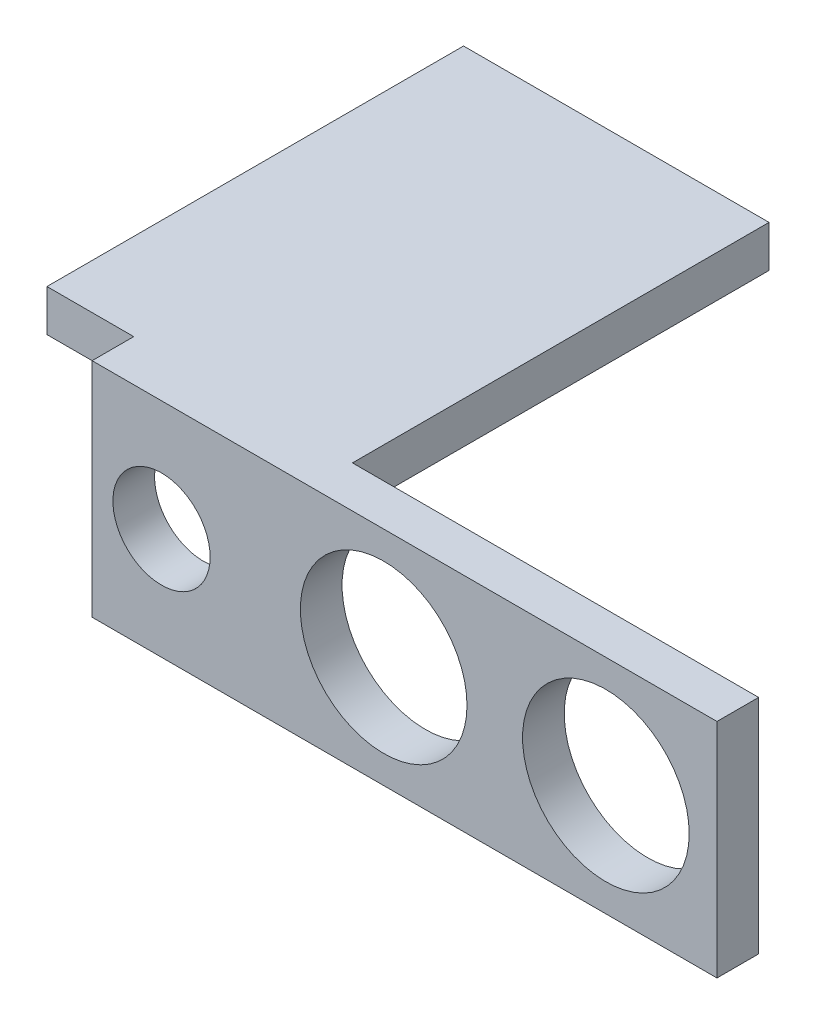
ISO-10303-21;
HEADER;
FILE_DESCRIPTION(('STEP AP214'),'2;1');
FILE_NAME('part.step','',(''),(''),'','','');
FILE_SCHEMA(('AUTOMOTIVE_DESIGN { 1 0 10303 214 1 1 1 1 }'));
ENDSEC;
DATA;
#1=APPLICATION_CONTEXT('core data for automotive mechanical design processes');
#2=APPLICATION_PROTOCOL_DEFINITION('international standard','automotive_design',2000,#1);
#3=PRODUCT_CONTEXT('',#1,'mechanical');
#4=PRODUCT('Part','Part','',(#3));
#5=PRODUCT_RELATED_PRODUCT_CATEGORY('part','',(#4));
#6=PRODUCT_DEFINITION_FORMATION('','',#4);
#7=PRODUCT_DEFINITION_CONTEXT('part definition',#1,'design');
#8=PRODUCT_DEFINITION('design','',#6,#7);
#9=PRODUCT_DEFINITION_SHAPE('','',#8);
#10=(LENGTH_UNIT() NAMED_UNIT(*) SI_UNIT(.MILLI.,.METRE.));
#11=(NAMED_UNIT(*) PLANE_ANGLE_UNIT() SI_UNIT($,.RADIAN.));
#12=(NAMED_UNIT(*) SI_UNIT($,.STERADIAN.) SOLID_ANGLE_UNIT());
#13=UNCERTAINTY_MEASURE_WITH_UNIT(LENGTH_MEASURE(1.E-05),#10,'distance_accuracy_value','');
#14=(GEOMETRIC_REPRESENTATION_CONTEXT(3) GLOBAL_UNCERTAINTY_ASSIGNED_CONTEXT((#13)) GLOBAL_UNIT_ASSIGNED_CONTEXT((#10,
#11,#12)) REPRESENTATION_CONTEXT('',''));
#15=CARTESIAN_POINT('',(0.,0.,0.));
#16=DIRECTION('',(0.,0.,1.));
#17=DIRECTION('',(1.,0.,0.));
#18=AXIS2_PLACEMENT_3D('',#15,#16,#17);
#19=CARTESIAN_POINT('',(0.,0.,0.));
#20=DIRECTION('',(0.,0.,1.));
#21=DIRECTION('',(1.,0.,0.));
#22=AXIS2_PLACEMENT_3D('',#19,#20,#21);
#23=PLANE('',#22);
#24=CARTESIAN_POINT('',(37.,-8.,0.));
#25=DIRECTION('',(0.,0.,1.));
#26=DIRECTION('',(1.,0.,0.));
#27=AXIS2_PLACEMENT_3D('',#24,#25,#26);
#28=CIRCLE('',#27,6.);
#29=CARTESIAN_POINT('',(43.,-8.,0.));
#30=VERTEX_POINT('',#29);
#31=EDGE_CURVE('E130',#30,#30,#28,.T.);
#32=ORIENTED_EDGE('',*,*,#31,.T.);
#33=EDGE_LOOP('',(#32));
#34=FACE_BOUND('',#33,.T.);
#35=CARTESIAN_POINT('',(21.,-8.,0.));
#36=DIRECTION('',(0.,0.,1.));
#37=DIRECTION('',(1.,0.,0.));
#38=AXIS2_PLACEMENT_3D('',#35,#36,#37);
#39=CIRCLE('',#38,6.);
#40=CARTESIAN_POINT('',(27.,-8.,0.));
#41=VERTEX_POINT('',#40);
#42=EDGE_CURVE('E140',#41,#41,#39,.T.);
#43=ORIENTED_EDGE('',*,*,#42,.T.);
#44=EDGE_LOOP('',(#43));
#45=FACE_BOUND('',#44,.T.);
#46=CARTESIAN_POINT('',(5.,-8.,0.));
#47=DIRECTION('',(0.,0.,1.));
#48=DIRECTION('',(1.,0.,0.));
#49=AXIS2_PLACEMENT_3D('',#46,#47,#48);
#50=CIRCLE('',#49,3.5);
#51=CARTESIAN_POINT('',(8.5,-8.,0.));
#52=VERTEX_POINT('',#51);
#53=EDGE_CURVE('E145',#52,#52,#50,.T.);
#54=ORIENTED_EDGE('',*,*,#53,.T.);
#55=EDGE_LOOP('',(#54));
#56=FACE_BOUND('',#55,.T.);
#57=DIRECTION('',(0.,-1.,0.));
#58=VECTOR('',#57,1.);
#59=CARTESIAN_POINT('',(15.75,0.,0.));
#60=LINE('',#59,#58);
#61=CARTESIAN_POINT('',(15.75,0.,0.));
#62=VERTEX_POINT('',#61);
#63=CARTESIAN_POINT('',(15.75,-3.,0.));
#64=VERTEX_POINT('',#63);
#65=EDGE_CURVE('E60',#62,#64,#60,.T.);
#66=ORIENTED_EDGE('',*,*,#65,.F.);
#67=DIRECTION('',(-1.,0.,0.));
#68=VECTOR('',#67,1.);
#69=CARTESIAN_POINT('',(0.,0.,0.));
#70=LINE('',#69,#68);
#71=CARTESIAN_POINT('',(45.,0.,0.));
#72=VERTEX_POINT('',#71);
#73=EDGE_CURVE('E158',#72,#62,#70,.T.);
#74=ORIENTED_EDGE('',*,*,#73,.F.);
#75=DIRECTION('',(0.,1.,0.));
#76=VECTOR('',#75,1.);
#77=CARTESIAN_POINT('',(45.,0.,0.));
#78=LINE('',#77,#76);
#79=CARTESIAN_POINT('',(45.,-16.,0.));
#80=VERTEX_POINT('',#79);
#81=EDGE_CURVE('E169',#80,#72,#78,.T.);
#82=ORIENTED_EDGE('',*,*,#81,.F.);
#83=DIRECTION('',(1.,0.,0.));
#84=VECTOR('',#83,1.);
#85=CARTESIAN_POINT('',(0.,-16.,0.));
#86=LINE('',#85,#84);
#87=CARTESIAN_POINT('',(0.,-16.,0.));
#88=VERTEX_POINT('',#87);
#89=EDGE_CURVE('E167',#88,#80,#86,.T.);
#90=ORIENTED_EDGE('',*,*,#89,.F.);
#91=DIRECTION('',(0.,-1.,0.));
#92=VECTOR('',#91,1.);
#93=CARTESIAN_POINT('',(0.,0.,0.));
#94=LINE('',#93,#92);
#95=CARTESIAN_POINT('',(0.,-3.,0.));
#96=VERTEX_POINT('',#95);
#97=EDGE_CURVE('E151',#96,#88,#94,.T.);
#98=ORIENTED_EDGE('',*,*,#97,.F.);
#99=DIRECTION('',(-1.,0.,0.));
#100=VECTOR('',#99,1.);
#101=CARTESIAN_POINT('',(15.75,-3.,0.));
#102=LINE('',#101,#100);
#103=EDGE_CURVE('E55',#64,#96,#102,.T.);
#104=ORIENTED_EDGE('',*,*,#103,.F.);
#105=EDGE_LOOP('',(#66,#74,#82,#90,#98,#104));
#106=FACE_BOUND('',#105,.T.);
#107=ADVANCED_FACE('F40',(#34,#45,#56,#106),#23,.F.);
#108=CARTESIAN_POINT('',(0.,0.,3.));
#109=DIRECTION('',(0.,0.,1.));
#110=DIRECTION('',(1.,0.,0.));
#111=AXIS2_PLACEMENT_3D('',#108,#109,#110);
#112=PLANE('',#111);
#113=CARTESIAN_POINT('',(21.,-8.,3.));
#114=DIRECTION('',(0.,0.,1.));
#115=DIRECTION('',(1.,0.,0.));
#116=AXIS2_PLACEMENT_3D('',#113,#114,#115);
#117=CIRCLE('',#116,6.);
#118=CARTESIAN_POINT('',(27.,-8.,3.));
#119=VERTEX_POINT('',#118);
#120=EDGE_CURVE('E142',#119,#119,#117,.T.);
#121=ORIENTED_EDGE('',*,*,#120,.F.);
#122=EDGE_LOOP('',(#121));
#123=FACE_BOUND('',#122,.T.);
#124=DIRECTION('',(0.,-1.,0.));
#125=VECTOR('',#124,1.);
#126=CARTESIAN_POINT('',(0.,0.,3.));
#127=LINE('',#126,#125);
#128=CARTESIAN_POINT('',(0.,0.,3.));
#129=VERTEX_POINT('',#128);
#130=CARTESIAN_POINT('',(0.,-16.,3.));
#131=VERTEX_POINT('',#130);
#132=EDGE_CURVE('E154',#129,#131,#127,.T.);
#133=ORIENTED_EDGE('',*,*,#132,.T.);
#134=DIRECTION('',(1.,0.,0.));
#135=VECTOR('',#134,1.);
#136=CARTESIAN_POINT('',(0.,-16.,3.));
#137=LINE('',#136,#135);
#138=CARTESIAN_POINT('',(45.,-16.,3.));
#139=VERTEX_POINT('',#138);
#140=EDGE_CURVE('E157',#131,#139,#137,.T.);
#141=ORIENTED_EDGE('',*,*,#140,.T.);
#142=DIRECTION('',(0.,1.,0.));
#143=VECTOR('',#142,1.);
#144=CARTESIAN_POINT('',(45.,0.,3.));
#145=LINE('',#144,#143);
#146=CARTESIAN_POINT('',(45.,0.,3.));
#147=VERTEX_POINT('',#146);
#148=EDGE_CURVE('E160',#139,#147,#145,.T.);
#149=ORIENTED_EDGE('',*,*,#148,.T.);
#150=DIRECTION('',(-1.,0.,0.));
#151=VECTOR('',#150,1.);
#152=CARTESIAN_POINT('',(0.,0.,3.));
#153=LINE('',#152,#151);
#154=EDGE_CURVE('E162',#147,#129,#153,.T.);
#155=ORIENTED_EDGE('',*,*,#154,.T.);
#156=EDGE_LOOP('',(#133,#141,#149,#155));
#157=FACE_BOUND('',#156,.T.);
#158=CARTESIAN_POINT('',(5.,-8.,3.));
#159=DIRECTION('',(0.,0.,1.));
#160=DIRECTION('',(1.,0.,0.));
#161=AXIS2_PLACEMENT_3D('',#158,#159,#160);
#162=CIRCLE('',#161,3.5);
#163=CARTESIAN_POINT('',(8.5,-8.,3.));
#164=VERTEX_POINT('',#163);
#165=EDGE_CURVE('E148',#164,#164,#162,.T.);
#166=ORIENTED_EDGE('',*,*,#165,.F.);
#167=EDGE_LOOP('',(#166));
#168=FACE_BOUND('',#167,.T.);
#169=CARTESIAN_POINT('',(37.,-8.,3.));
#170=DIRECTION('',(0.,0.,1.));
#171=DIRECTION('',(1.,0.,0.));
#172=AXIS2_PLACEMENT_3D('',#169,#170,#171);
#173=CIRCLE('',#172,6.);
#174=CARTESIAN_POINT('',(43.,-8.,3.));
#175=VERTEX_POINT('',#174);
#176=EDGE_CURVE('E133',#175,#175,#173,.T.);
#177=ORIENTED_EDGE('',*,*,#176,.F.);
#178=EDGE_LOOP('',(#177));
#179=FACE_BOUND('',#178,.T.);
#180=ADVANCED_FACE('F213',(#123,#157,#168,#179),#112,.T.);
#181=CARTESIAN_POINT('',(0.,0.,3.));
#182=DIRECTION('',(1.,0.,0.));
#183=DIRECTION('',(0.,1.,0.));
#184=AXIS2_PLACEMENT_3D('',#181,#182,#183);
#185=PLANE('',#184);
#186=CARTESIAN_POINT('',(0.,0.,0.));
#187=VERTEX_POINT('',#186);
#188=EDGE_CURVE('E165',#187,#96,#94,.T.);
#189=ORIENTED_EDGE('',*,*,#188,.T.);
#190=ORIENTED_EDGE('',*,*,#97,.T.);
#191=DIRECTION('',(0.,0.,-1.));
#192=VECTOR('',#191,1.);
#193=CARTESIAN_POINT('',(0.,-16.,3.));
#194=LINE('',#193,#192);
#195=EDGE_CURVE('E11',#131,#88,#194,.T.);
#196=ORIENTED_EDGE('',*,*,#195,.F.);
#197=ORIENTED_EDGE('',*,*,#132,.F.);
#198=DIRECTION('',(0.,0.,-1.));
#199=VECTOR('',#198,1.);
#200=CARTESIAN_POINT('',(0.,0.,3.));
#201=LINE('',#200,#199);
#202=EDGE_CURVE('E164',#129,#187,#201,.T.);
#203=ORIENTED_EDGE('',*,*,#202,.T.);
#204=EDGE_LOOP('',(#189,#190,#196,#197,#203));
#205=FACE_BOUND('',#204,.T.);
#206=ADVANCED_FACE('F42',(#205),#185,.F.);
#207=CARTESIAN_POINT('',(0.,-16.,3.));
#208=DIRECTION('',(0.,1.,0.));
#209=DIRECTION('',(0.,0.,1.));
#210=AXIS2_PLACEMENT_3D('',#207,#208,#209);
#211=PLANE('',#210);
#212=ORIENTED_EDGE('',*,*,#89,.T.);
#213=DIRECTION('',(0.,0.,-1.));
#214=VECTOR('',#213,1.);
#215=CARTESIAN_POINT('',(45.,-16.,3.));
#216=LINE('',#215,#214);
#217=EDGE_CURVE('E48',#139,#80,#216,.T.);
#218=ORIENTED_EDGE('',*,*,#217,.F.);
#219=ORIENTED_EDGE('',*,*,#140,.F.);
#220=ORIENTED_EDGE('',*,*,#195,.T.);
#221=EDGE_LOOP('',(#212,#218,#219,#220));
#222=FACE_BOUND('',#221,.T.);
#223=ADVANCED_FACE('F215',(#222),#211,.F.);
#224=CARTESIAN_POINT('',(45.,0.,3.));
#225=DIRECTION('',(-1.,0.,0.));
#226=DIRECTION('',(0.,0.,1.));
#227=AXIS2_PLACEMENT_3D('',#224,#225,#226);
#228=PLANE('',#227);
#229=ORIENTED_EDGE('',*,*,#81,.T.);
#230=DIRECTION('',(0.,0.,-1.));
#231=VECTOR('',#230,1.);
#232=CARTESIAN_POINT('',(45.,0.,3.));
#233=LINE('',#232,#231);
#234=EDGE_CURVE('E173',#147,#72,#233,.T.);
#235=ORIENTED_EDGE('',*,*,#234,.F.);
#236=ORIENTED_EDGE('',*,*,#148,.F.);
#237=ORIENTED_EDGE('',*,*,#217,.T.);
#238=EDGE_LOOP('',(#229,#235,#236,#237));
#239=FACE_BOUND('',#238,.T.);
#240=ADVANCED_FACE('F180',(#239),#228,.F.);
#241=CARTESIAN_POINT('',(0.,0.,3.));
#242=DIRECTION('',(0.,-1.,0.));
#243=DIRECTION('',(1.,0.,0.));
#244=AXIS2_PLACEMENT_3D('',#241,#242,#243);
#245=PLANE('',#244);
#246=ORIENTED_EDGE('',*,*,#73,.T.);
#247=DIRECTION('',(0.,0.,1.));
#248=VECTOR('',#247,1.);
#249=CARTESIAN_POINT('',(15.75,0.,-30.));
#250=LINE('',#249,#248);
#251=CARTESIAN_POINT('',(15.75,0.,-30.));
#252=VERTEX_POINT('',#251);
#253=EDGE_CURVE('E186',#252,#62,#250,.T.);
#254=ORIENTED_EDGE('',*,*,#253,.F.);
#255=DIRECTION('',(1.,0.,0.));
#256=VECTOR('',#255,1.);
#257=CARTESIAN_POINT('',(15.75,0.,-30.));
#258=LINE('',#257,#256);
#259=CARTESIAN_POINT('',(-6.25,0.,-30.));
#260=VERTEX_POINT('',#259);
#261=EDGE_CURVE('E123',#260,#252,#258,.T.);
#262=ORIENTED_EDGE('',*,*,#261,.F.);
#263=DIRECTION('',(0.,0.,1.));
#264=VECTOR('',#263,1.);
#265=CARTESIAN_POINT('',(-6.25,0.,-30.));
#266=LINE('',#265,#264);
#267=CARTESIAN_POINT('',(-6.25,0.,0.));
#268=VERTEX_POINT('',#267);
#269=EDGE_CURVE('E135',#260,#268,#266,.T.);
#270=ORIENTED_EDGE('',*,*,#269,.T.);
#271=DIRECTION('',(1.,0.,0.));
#272=VECTOR('',#271,1.);
#273=CARTESIAN_POINT('',(15.75,0.,0.));
#274=LINE('',#273,#272);
#275=EDGE_CURVE('E127',#268,#187,#274,.T.);
#276=ORIENTED_EDGE('',*,*,#275,.T.);
#277=ORIENTED_EDGE('',*,*,#202,.F.);
#278=ORIENTED_EDGE('',*,*,#154,.F.);
#279=ORIENTED_EDGE('',*,*,#234,.T.);
#280=EDGE_LOOP('',(#246,#254,#262,#270,#276,#277,#278,#279));
#281=FACE_BOUND('',#280,.T.);
#282=ADVANCED_FACE('F185',(#281),#245,.F.);
#283=CARTESIAN_POINT('',(5.,-8.,3.));
#284=DIRECTION('',(0.,0.,-1.));
#285=DIRECTION('',(-1.,0.,0.));
#286=AXIS2_PLACEMENT_3D('',#283,#284,#285);
#287=CYLINDRICAL_SURFACE('',#286,3.5);
#288=ORIENTED_EDGE('',*,*,#165,.T.);
#289=EDGE_LOOP('',(#288));
#290=FACE_BOUND('',#289,.T.);
#291=ORIENTED_EDGE('',*,*,#53,.F.);
#292=EDGE_LOOP('',(#291));
#293=FACE_BOUND('',#292,.T.);
#294=ADVANCED_FACE('F234',(#290,#293),#287,.F.);
#295=CARTESIAN_POINT('',(21.,-8.,3.));
#296=DIRECTION('',(0.,0.,-1.));
#297=DIRECTION('',(-1.,0.,0.));
#298=AXIS2_PLACEMENT_3D('',#295,#296,#297);
#299=CYLINDRICAL_SURFACE('',#298,6.);
#300=ORIENTED_EDGE('',*,*,#120,.T.);
#301=EDGE_LOOP('',(#300));
#302=FACE_BOUND('',#301,.T.);
#303=ORIENTED_EDGE('',*,*,#42,.F.);
#304=EDGE_LOOP('',(#303));
#305=FACE_BOUND('',#304,.T.);
#306=ADVANCED_FACE('F238',(#302,#305),#299,.F.);
#307=CARTESIAN_POINT('',(37.,-8.,3.));
#308=DIRECTION('',(0.,0.,-1.));
#309=DIRECTION('',(-1.,0.,0.));
#310=AXIS2_PLACEMENT_3D('',#307,#308,#309);
#311=CYLINDRICAL_SURFACE('',#310,6.);
#312=ORIENTED_EDGE('',*,*,#176,.T.);
#313=EDGE_LOOP('',(#312));
#314=FACE_BOUND('',#313,.T.);
#315=ORIENTED_EDGE('',*,*,#31,.F.);
#316=EDGE_LOOP('',(#315));
#317=FACE_BOUND('',#316,.T.);
#318=ADVANCED_FACE('F243',(#314,#317),#311,.F.);
#319=CARTESIAN_POINT('',(15.75,0.,-30.));
#320=DIRECTION('',(-1.,0.,0.));
#321=DIRECTION('',(0.,0.,1.));
#322=AXIS2_PLACEMENT_3D('',#319,#320,#321);
#323=PLANE('',#322);
#324=ORIENTED_EDGE('',*,*,#65,.T.);
#325=DIRECTION('',(0.,0.,1.));
#326=VECTOR('',#325,1.);
#327=CARTESIAN_POINT('',(15.75,-3.,-30.));
#328=LINE('',#327,#326);
#329=CARTESIAN_POINT('',(15.75,-3.,-30.));
#330=VERTEX_POINT('',#329);
#331=EDGE_CURVE('E112',#330,#64,#328,.T.);
#332=ORIENTED_EDGE('',*,*,#331,.F.);
#333=DIRECTION('',(0.,-1.,0.));
#334=VECTOR('',#333,1.);
#335=CARTESIAN_POINT('',(15.75,0.,-30.));
#336=LINE('',#335,#334);
#337=EDGE_CURVE('E118',#252,#330,#336,.T.);
#338=ORIENTED_EDGE('',*,*,#337,.F.);
#339=ORIENTED_EDGE('',*,*,#253,.T.);
#340=EDGE_LOOP('',(#324,#332,#338,#339));
#341=FACE_BOUND('',#340,.T.);
#342=ADVANCED_FACE('F129',(#341),#323,.F.);
#343=CARTESIAN_POINT('',(15.75,-3.,-30.));
#344=DIRECTION('',(0.,1.,0.));
#345=DIRECTION('',(0.,0.,1.));
#346=AXIS2_PLACEMENT_3D('',#343,#344,#345);
#347=PLANE('',#346);
#348=ORIENTED_EDGE('',*,*,#103,.T.);
#349=CARTESIAN_POINT('',(-6.25,-3.,0.));
#350=VERTEX_POINT('',#349);
#351=EDGE_CURVE('E197',#96,#350,#102,.T.);
#352=ORIENTED_EDGE('',*,*,#351,.T.);
#353=DIRECTION('',(0.,0.,1.));
#354=VECTOR('',#353,1.);
#355=CARTESIAN_POINT('',(-6.25,-3.,-30.));
#356=LINE('',#355,#354);
#357=CARTESIAN_POINT('',(-6.25,-3.,-30.));
#358=VERTEX_POINT('',#357);
#359=EDGE_CURVE('E114',#358,#350,#356,.T.);
#360=ORIENTED_EDGE('',*,*,#359,.F.);
#361=DIRECTION('',(-1.,0.,0.));
#362=VECTOR('',#361,1.);
#363=CARTESIAN_POINT('',(15.75,-3.,-30.));
#364=LINE('',#363,#362);
#365=EDGE_CURVE('E108',#330,#358,#364,.T.);
#366=ORIENTED_EDGE('',*,*,#365,.F.);
#367=ORIENTED_EDGE('',*,*,#331,.T.);
#368=EDGE_LOOP('',(#348,#352,#360,#366,#367));
#369=FACE_BOUND('',#368,.T.);
#370=ADVANCED_FACE('F110',(#369),#347,.F.);
#371=CARTESIAN_POINT('',(-6.25,0.,-30.));
#372=DIRECTION('',(1.,0.,0.));
#373=DIRECTION('',(0.,1.,0.));
#374=AXIS2_PLACEMENT_3D('',#371,#372,#373);
#375=PLANE('',#374);
#376=DIRECTION('',(0.,1.,0.));
#377=VECTOR('',#376,1.);
#378=CARTESIAN_POINT('',(-6.25,0.,0.));
#379=LINE('',#378,#377);
#380=EDGE_CURVE('E194',#350,#268,#379,.T.);
#381=ORIENTED_EDGE('',*,*,#380,.T.);
#382=ORIENTED_EDGE('',*,*,#269,.F.);
#383=DIRECTION('',(0.,1.,0.));
#384=VECTOR('',#383,1.);
#385=CARTESIAN_POINT('',(-6.25,0.,-30.));
#386=LINE('',#385,#384);
#387=EDGE_CURVE('E117',#358,#260,#386,.T.);
#388=ORIENTED_EDGE('',*,*,#387,.F.);
#389=ORIENTED_EDGE('',*,*,#359,.T.);
#390=EDGE_LOOP('',(#381,#382,#388,#389));
#391=FACE_BOUND('',#390,.T.);
#392=ADVANCED_FACE('F201',(#391),#375,.F.);
#393=CARTESIAN_POINT('',(0.,0.,-30.));
#394=DIRECTION('',(0.,0.,-1.));
#395=DIRECTION('',(-1.,0.,0.));
#396=AXIS2_PLACEMENT_3D('',#393,#394,#395);
#397=PLANE('',#396);
#398=ORIENTED_EDGE('',*,*,#337,.T.);
#399=ORIENTED_EDGE('',*,*,#365,.T.);
#400=ORIENTED_EDGE('',*,*,#387,.T.);
#401=ORIENTED_EDGE('',*,*,#261,.T.);
#402=EDGE_LOOP('',(#398,#399,#400,#401));
#403=FACE_BOUND('',#402,.T.);
#404=ADVANCED_FACE('F121',(#403),#397,.T.);
#405=CARTESIAN_POINT('',(0.,0.,0.));
#406=DIRECTION('',(0.,0.,-1.));
#407=DIRECTION('',(-1.,0.,0.));
#408=AXIS2_PLACEMENT_3D('',#405,#406,#407);
#409=PLANE('',#408);
#410=ORIENTED_EDGE('',*,*,#188,.F.);
#411=ORIENTED_EDGE('',*,*,#275,.F.);
#412=ORIENTED_EDGE('',*,*,#380,.F.);
#413=ORIENTED_EDGE('',*,*,#351,.F.);
#414=EDGE_LOOP('',(#410,#411,#412,#413));
#415=FACE_BOUND('',#414,.T.);
#416=ADVANCED_FACE('F207',(#415),#409,.F.);
#417=CLOSED_SHELL('',(#107,#180,#206,#223,#240,#282,#294,#306,#318,#342,#370,#392,#404,#416));
#418=MANIFOLD_SOLID_BREP('B2',#417);
#419=ADVANCED_BREP_SHAPE_REPRESENTATION('',(#18,#418),#14);
#420=SHAPE_DEFINITION_REPRESENTATION(#9,#419);
ENDSEC;
END-ISO-10303-21;
